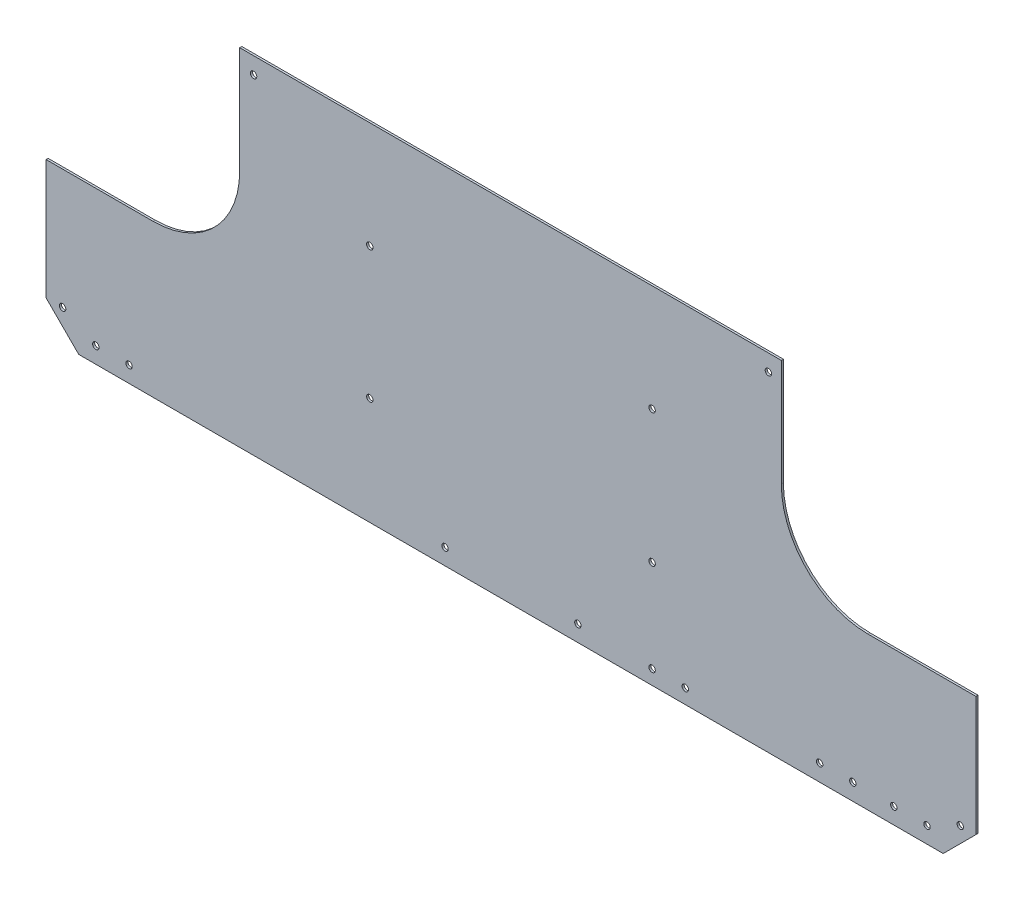
ISO-10303-21;
HEADER;
FILE_DESCRIPTION(('STEP AP214'),'2;1');
FILE_NAME('part.step','',(''),(''),'','','');
FILE_SCHEMA(('AUTOMOTIVE_DESIGN { 1 0 10303 214 1 1 1 1 }'));
ENDSEC;
DATA;
#1=APPLICATION_CONTEXT('core data for automotive mechanical design processes');
#2=APPLICATION_PROTOCOL_DEFINITION('international standard','automotive_design',2000,#1);
#3=PRODUCT_CONTEXT('',#1,'mechanical');
#4=PRODUCT('Part','Part','',(#3));
#5=PRODUCT_RELATED_PRODUCT_CATEGORY('part','',(#4));
#6=PRODUCT_DEFINITION_FORMATION('','',#4);
#7=PRODUCT_DEFINITION_CONTEXT('part definition',#1,'design');
#8=PRODUCT_DEFINITION('design','',#6,#7);
#9=PRODUCT_DEFINITION_SHAPE('','',#8);
#10=(LENGTH_UNIT() NAMED_UNIT(*) SI_UNIT(.MILLI.,.METRE.));
#11=(NAMED_UNIT(*) PLANE_ANGLE_UNIT() SI_UNIT($,.RADIAN.));
#12=(NAMED_UNIT(*) SI_UNIT($,.STERADIAN.) SOLID_ANGLE_UNIT());
#13=UNCERTAINTY_MEASURE_WITH_UNIT(LENGTH_MEASURE(1.E-05),#10,'distance_accuracy_value','');
#14=(GEOMETRIC_REPRESENTATION_CONTEXT(3) GLOBAL_UNCERTAINTY_ASSIGNED_CONTEXT((#13)) GLOBAL_UNIT_ASSIGNED_CONTEXT((#10,
#11,#12)) REPRESENTATION_CONTEXT('',''));
#15=CARTESIAN_POINT('',(0.,0.,0.));
#16=DIRECTION('',(0.,0.,1.));
#17=DIRECTION('',(1.,0.,0.));
#18=AXIS2_PLACEMENT_3D('',#15,#16,#17);
#19=CARTESIAN_POINT('',(-457.2,-304.8,0.79375));
#20=DIRECTION('',(0.,1.,0.));
#21=DIRECTION('',(0.,0.,1.));
#22=AXIS2_PLACEMENT_3D('',#19,#20,#21);
#23=PLANE('',#22);
#24=DIRECTION('',(0.,0.,1.));
#25=VECTOR('',#24,1.);
#26=CARTESIAN_POINT('',(-352.505582237217,-304.8,0.79375));
#27=LINE('',#26,#25);
#28=CARTESIAN_POINT('',(-352.505582237217,-304.8,-0.79375));
#29=VERTEX_POINT('',#28);
#30=CARTESIAN_POINT('',(-352.505582237217,-304.8,0.79375));
#31=VERTEX_POINT('',#30);
#32=EDGE_CURVE('E192',#29,#31,#27,.T.);
#33=ORIENTED_EDGE('',*,*,#32,.F.);
#34=DIRECTION('',(1.,0.,0.));
#35=VECTOR('',#34,1.);
#36=CARTESIAN_POINT('',(-457.2,-304.8,-0.79375));
#37=LINE('',#36,#35);
#38=CARTESIAN_POINT('',(308.635705779588,-304.8,-0.79375));
#39=VERTEX_POINT('',#38);
#40=EDGE_CURVE('E194',#29,#39,#37,.T.);
#41=ORIENTED_EDGE('',*,*,#40,.T.);
#42=DIRECTION('',(0.,0.,-1.));
#43=VECTOR('',#42,1.);
#44=CARTESIAN_POINT('',(308.635705779588,-304.8,0.79375));
#45=LINE('',#44,#43);
#46=CARTESIAN_POINT('',(308.635705779588,-304.8,0.79375));
#47=VERTEX_POINT('',#46);
#48=EDGE_CURVE('E189',#47,#39,#45,.T.);
#49=ORIENTED_EDGE('',*,*,#48,.F.);
#50=DIRECTION('',(1.,0.,0.));
#51=VECTOR('',#50,1.);
#52=CARTESIAN_POINT('',(-457.2,-304.8,0.79375));
#53=LINE('',#52,#51);
#54=EDGE_CURVE('E195',#31,#47,#53,.T.);
#55=ORIENTED_EDGE('',*,*,#54,.F.);
#56=EDGE_LOOP('',(#33,#41,#49,#55));
#57=FACE_BOUND('',#56,.T.);
#58=ADVANCED_FACE('F38',(#57),#23,.F.);
#59=CARTESIAN_POINT('',(0.,0.,0.79375));
#60=DIRECTION('',(0.,0.,1.));
#61=DIRECTION('',(1.,0.,0.));
#62=AXIS2_PLACEMENT_3D('',#59,#60,#61);
#63=PLANE('',#62);
#64=CARTESIAN_POINT('',(-129.884938330218,-121.629072032612,0.793750000000001));
#65=DIRECTION('',(0.,0.,1.));
#66=DIRECTION('',(1.,0.,0.));
#67=AXIS2_PLACEMENT_3D('',#64,#65,#66);
#68=CIRCLE('',#67,2.45745);
#69=CARTESIAN_POINT('',(-127.427488330218,-121.629072032612,0.793750000000001));
#70=VERTEX_POINT('',#69);
#71=EDGE_CURVE('E282',#70,#70,#68,.T.);
#72=ORIENTED_EDGE('',*,*,#71,.F.);
#73=EDGE_LOOP('',(#72));
#74=FACE_BOUND('',#73,.T.);
#75=CARTESIAN_POINT('',(-129.884938330218,-222.541034233955,0.793750000000001));
#76=DIRECTION('',(0.,0.,1.));
#77=DIRECTION('',(1.,0.,0.));
#78=AXIS2_PLACEMENT_3D('',#75,#76,#77);
#79=CIRCLE('',#78,2.45745);
#80=CARTESIAN_POINT('',(-127.427488330218,-222.541034233955,0.793750000000001));
#81=VERTEX_POINT('',#80);
#82=EDGE_CURVE('E286',#81,#81,#79,.T.);
#83=ORIENTED_EDGE('',*,*,#82,.F.);
#84=EDGE_LOOP('',(#83));
#85=FACE_BOUND('',#84,.T.);
#86=CARTESIAN_POINT('',(86.0150618725894,-223.22907197577,0.793750000000001));
#87=DIRECTION('',(0.,0.,1.));
#88=DIRECTION('',(1.,0.,0.));
#89=AXIS2_PLACEMENT_3D('',#86,#87,#88);
#90=CIRCLE('',#89,2.45744999999999);
#91=CARTESIAN_POINT('',(88.4725118725893,-223.22907197577,0.793750000000001));
#92=VERTEX_POINT('',#91);
#93=EDGE_CURVE('E290',#92,#92,#90,.T.);
#94=ORIENTED_EDGE('',*,*,#93,.F.);
#95=EDGE_LOOP('',(#94));
#96=FACE_BOUND('',#95,.T.);
#97=CARTESIAN_POINT('',(86.0150618725894,-121.629072032612,0.793750000000001));
#98=DIRECTION('',(0.,0.,1.));
#99=DIRECTION('',(1.,0.,0.));
#100=AXIS2_PLACEMENT_3D('',#97,#98,#99);
#101=CIRCLE('',#100,2.45744999999999);
#102=CARTESIAN_POINT('',(88.4725118725893,-121.629072032612,0.793750000000001));
#103=VERTEX_POINT('',#102);
#104=EDGE_CURVE('E294',#103,#103,#101,.T.);
#105=ORIENTED_EDGE('',*,*,#104,.F.);
#106=EDGE_LOOP('',(#105));
#107=FACE_BOUND('',#106,.T.);
#108=CARTESIAN_POINT('',(-314.03493822881,-292.470644008425,0.793750000000001));
#109=DIRECTION('',(0.,0.,1.));
#110=DIRECTION('',(1.,0.,0.));
#111=AXIS2_PLACEMENT_3D('',#108,#109,#110);
#112=CIRCLE('',#111,2.45744999999997);
#113=CARTESIAN_POINT('',(-311.57748822881,-292.470644008425,0.793750000000001));
#114=VERTEX_POINT('',#113);
#115=EDGE_CURVE('E298',#114,#114,#112,.T.);
#116=ORIENTED_EDGE('',*,*,#115,.F.);
#117=EDGE_LOOP('',(#116));
#118=FACE_BOUND('',#117,.T.);
#119=CARTESIAN_POINT('',(-339.43493822881,-292.470644008425,0.793750000000001));
#120=DIRECTION('',(0.,0.,1.));
#121=DIRECTION('',(1.,0.,0.));
#122=AXIS2_PLACEMENT_3D('',#119,#120,#121);
#123=CIRCLE('',#122,2.45744999999997);
#124=CARTESIAN_POINT('',(-336.97748822881,-292.470644008425,0.793750000000001));
#125=VERTEX_POINT('',#124);
#126=EDGE_CURVE('E302',#125,#125,#123,.T.);
#127=ORIENTED_EDGE('',*,*,#126,.F.);
#128=EDGE_LOOP('',(#127));
#129=FACE_BOUND('',#128,.T.);
#130=CARTESIAN_POINT('',(-364.83493822881,-279.770644008424,0.793750000000001));
#131=DIRECTION('',(0.,0.,1.));
#132=DIRECTION('',(1.,0.,0.));
#133=AXIS2_PLACEMENT_3D('',#130,#131,#132);
#134=CIRCLE('',#133,2.45744999999997);
#135=CARTESIAN_POINT('',(-362.37748822881,-279.770644008424,0.793750000000001));
#136=VERTEX_POINT('',#135);
#137=EDGE_CURVE('E306',#136,#136,#134,.T.);
#138=ORIENTED_EDGE('',*,*,#137,.F.);
#139=EDGE_LOOP('',(#138));
#140=FACE_BOUND('',#139,.T.);
#141=CARTESIAN_POINT('',(86.0055468827309,-293.702239208237,0.793750000000001));
#142=DIRECTION('',(0.,0.,1.));
#143=DIRECTION('',(1.,0.,0.));
#144=AXIS2_PLACEMENT_3D('',#141,#142,#143);
#145=CIRCLE('',#144,2.45744999999999);
#146=CARTESIAN_POINT('',(88.4629968827309,-293.702239208237,0.793750000000001));
#147=VERTEX_POINT('',#146);
#148=EDGE_CURVE('E310',#147,#147,#145,.T.);
#149=ORIENTED_EDGE('',*,*,#148,.F.);
#150=EDGE_LOOP('',(#149));
#151=FACE_BOUND('',#150,.T.);
#152=CARTESIAN_POINT('',(111.405546882731,-293.702239208237,0.793750000000001));
#153=DIRECTION('',(0.,0.,1.));
#154=DIRECTION('',(1.,0.,0.));
#155=AXIS2_PLACEMENT_3D('',#152,#153,#154);
#156=CIRCLE('',#155,2.45744999999999);
#157=CARTESIAN_POINT('',(113.862996882731,-293.702239208237,0.793750000000001));
#158=VERTEX_POINT('',#157);
#159=EDGE_CURVE('E314',#158,#158,#156,.T.);
#160=ORIENTED_EDGE('',*,*,#159,.F.);
#161=EDGE_LOOP('',(#160));
#162=FACE_BOUND('',#161,.T.);
#163=CARTESIAN_POINT('',(214.149530262216,-292.114748820738,0.793750000000001));
#164=DIRECTION('',(0.,0.,1.));
#165=DIRECTION('',(1.,0.,0.));
#166=AXIS2_PLACEMENT_3D('',#163,#164,#165);
#167=CIRCLE('',#166,2.45745);
#168=CARTESIAN_POINT('',(216.606980262216,-292.114748820738,0.793750000000001));
#169=VERTEX_POINT('',#168);
#170=EDGE_CURVE('E318',#169,#169,#167,.T.);
#171=ORIENTED_EDGE('',*,*,#170,.F.);
#172=EDGE_LOOP('',(#171));
#173=FACE_BOUND('',#172,.T.);
#174=CARTESIAN_POINT('',(239.549530262216,-292.114748820738,0.793750000000001));
#175=DIRECTION('',(0.,0.,1.));
#176=DIRECTION('',(1.,0.,0.));
#177=AXIS2_PLACEMENT_3D('',#174,#175,#176);
#178=CIRCLE('',#177,2.45745);
#179=CARTESIAN_POINT('',(242.006980262216,-292.114748820738,0.793750000000001));
#180=VERTEX_POINT('',#179);
#181=EDGE_CURVE('E322',#180,#180,#178,.T.);
#182=ORIENTED_EDGE('',*,*,#181,.F.);
#183=EDGE_LOOP('',(#182));
#184=FACE_BOUND('',#183,.T.);
#185=CARTESIAN_POINT('',(296.27626177119,-292.470644008388,0.793750000000001));
#186=DIRECTION('',(0.,0.,1.));
#187=DIRECTION('',(1.,0.,0.));
#188=AXIS2_PLACEMENT_3D('',#185,#186,#187);
#189=CIRCLE('',#188,2.45744999999997);
#190=CARTESIAN_POINT('',(298.73371177119,-292.470644008388,0.793750000000001));
#191=VERTEX_POINT('',#190);
#192=EDGE_CURVE('E326',#191,#191,#189,.T.);
#193=ORIENTED_EDGE('',*,*,#192,.F.);
#194=EDGE_LOOP('',(#193));
#195=FACE_BOUND('',#194,.T.);
#196=CARTESIAN_POINT('',(270.87626177119,-292.470644008388,0.793750000000001));
#197=DIRECTION('',(0.,0.,1.));
#198=DIRECTION('',(1.,0.,0.));
#199=AXIS2_PLACEMENT_3D('',#196,#197,#198);
#200=CIRCLE('',#199,2.45744999999997);
#201=CARTESIAN_POINT('',(273.33371177119,-292.470644008388,0.793750000000001));
#202=VERTEX_POINT('',#201);
#203=EDGE_CURVE('E330',#202,#202,#200,.T.);
#204=ORIENTED_EDGE('',*,*,#203,.F.);
#205=EDGE_LOOP('',(#204));
#206=FACE_BOUND('',#205,.T.);
#207=CARTESIAN_POINT('',(321.67626177119,-279.770644008388,0.793750000000001));
#208=DIRECTION('',(0.,0.,1.));
#209=DIRECTION('',(1.,0.,0.));
#210=AXIS2_PLACEMENT_3D('',#207,#208,#209);
#211=CIRCLE('',#210,2.45744999999997);
#212=CARTESIAN_POINT('',(324.13371177119,-279.770644008388,0.793750000000001));
#213=VERTEX_POINT('',#212);
#214=EDGE_CURVE('E334',#213,#213,#211,.T.);
#215=ORIENTED_EDGE('',*,*,#214,.F.);
#216=EDGE_LOOP('',(#215));
#217=FACE_BOUND('',#216,.T.);
#218=CARTESIAN_POINT('',(174.915061771195,-52.7581440084142,0.793750000000001));
#219=DIRECTION('',(0.,0.,1.));
#220=DIRECTION('',(1.,0.,0.));
#221=AXIS2_PLACEMENT_3D('',#218,#219,#220);
#222=CIRCLE('',#221,2.45745);
#223=CARTESIAN_POINT('',(177.372511771195,-52.7581440084142,0.793750000000001));
#224=VERTEX_POINT('',#223);
#225=EDGE_CURVE('E338',#224,#224,#222,.T.);
#226=ORIENTED_EDGE('',*,*,#225,.F.);
#227=EDGE_LOOP('',(#226));
#228=FACE_BOUND('',#227,.T.);
#229=CARTESIAN_POINT('',(-218.784938228805,-52.7581440084113,0.793750000000001));
#230=DIRECTION('',(0.,0.,1.));
#231=DIRECTION('',(1.,0.,0.));
#232=AXIS2_PLACEMENT_3D('',#229,#230,#231);
#233=CIRCLE('',#232,2.45745);
#234=CARTESIAN_POINT('',(-216.327488228805,-52.7581440084113,0.793750000000001));
#235=VERTEX_POINT('',#234);
#236=EDGE_CURVE('E342',#235,#235,#233,.T.);
#237=ORIENTED_EDGE('',*,*,#236,.F.);
#238=EDGE_LOOP('',(#237));
#239=FACE_BOUND('',#238,.T.);
#240=CARTESIAN_POINT('',(-72.3793382288082,-292.470644008412,0.793750000000001));
#241=DIRECTION('',(0.,0.,1.));
#242=DIRECTION('',(1.,0.,0.));
#243=AXIS2_PLACEMENT_3D('',#240,#241,#242);
#244=CIRCLE('',#243,2.45744999999999);
#245=CARTESIAN_POINT('',(-69.9218882288082,-292.470644008412,0.793750000000001));
#246=VERTEX_POINT('',#245);
#247=EDGE_CURVE('E346',#246,#246,#244,.T.);
#248=ORIENTED_EDGE('',*,*,#247,.F.);
#249=EDGE_LOOP('',(#248));
#250=FACE_BOUND('',#249,.T.);
#251=CARTESIAN_POINT('',(29.2206617711918,-292.470644008414,0.793750000000001));
#252=DIRECTION('',(0.,0.,1.));
#253=DIRECTION('',(1.,0.,0.));
#254=AXIS2_PLACEMENT_3D('',#251,#252,#253);
#255=CIRCLE('',#254,2.45744999999999);
#256=CARTESIAN_POINT('',(31.6781117711918,-292.470644008414,0.793750000000001));
#257=VERTEX_POINT('',#256);
#258=EDGE_CURVE('E349',#257,#257,#255,.T.);
#259=ORIENTED_EDGE('',*,*,#258,.F.);
#260=EDGE_LOOP('',(#259));
#261=FACE_BOUND('',#260,.T.);
#262=DIRECTION('',(0.,-1.,0.));
#263=VECTOR('',#262,1.);
#264=CARTESIAN_POINT('',(184.821061771176,-121.896344020848,0.79375));
#265=LINE('',#264,#263);
#266=CARTESIAN_POINT('',(184.821061771176,-40.0581440083884,0.79375));
#267=VERTEX_POINT('',#266);
#268=CARTESIAN_POINT('',(184.821061771176,-121.896344020848,0.79375));
#269=VERTEX_POINT('',#268);
#270=EDGE_CURVE('E133',#267,#269,#265,.T.);
#271=ORIENTED_EDGE('',*,*,#270,.F.);
#272=DIRECTION('',(-1.,0.,0.));
#273=VECTOR('',#272,1.);
#274=CARTESIAN_POINT('',(-374.994938228831,-40.0581440083885,0.79375));
#275=LINE('',#274,#273);
#276=CARTESIAN_POINT('',(-229.402738216363,-40.0581440083885,0.79375));
#277=VERTEX_POINT('',#276);
#278=EDGE_CURVE('E60',#267,#277,#275,.T.);
#279=ORIENTED_EDGE('',*,*,#278,.T.);
#280=DIRECTION('',(0.,1.,0.));
#281=VECTOR('',#280,1.);
#282=CARTESIAN_POINT('',(-229.402738216363,-64.7463440208438,0.79375));
#283=LINE('',#282,#281);
#284=CARTESIAN_POINT('',(-229.402738216364,-121.896344020841,0.79375));
#285=VERTEX_POINT('',#284);
#286=EDGE_CURVE('E162',#285,#277,#283,.T.);
#287=ORIENTED_EDGE('',*,*,#286,.F.);
#288=CARTESIAN_POINT('',(-295.696738216364,-121.896344020841,0.79375));
#289=DIRECTION('',(0.,0.,1.));
#290=DIRECTION('',(-1.,0.,0.));
#291=AXIS2_PLACEMENT_3D('',#288,#289,#290);
#292=CIRCLE('',#291,66.2940000000005);
#293=CARTESIAN_POINT('',(-295.696738216365,-188.190344020841,0.79375));
#294=VERTEX_POINT('',#293);
#295=EDGE_CURVE('E159',#294,#285,#292,.T.);
#296=ORIENTED_EDGE('',*,*,#295,.F.);
#297=DIRECTION('',(1.,0.,0.));
#298=VECTOR('',#297,1.);
#299=CARTESIAN_POINT('',(-352.846738216365,-188.19034402084,0.79375));
#300=LINE('',#299,#298);
#301=CARTESIAN_POINT('',(-377.534938228824,-188.19034402084,0.79375));
#302=VERTEX_POINT('',#301);
#303=EDGE_CURVE('E156',#302,#294,#300,.T.);
#304=ORIENTED_EDGE('',*,*,#303,.F.);
#305=DIRECTION('',(0.,-1.,0.));
#306=VECTOR('',#305,1.);
#307=CARTESIAN_POINT('',(-377.534938228825,-279.770644008392,0.79375));
#308=LINE('',#307,#306);
#309=CARTESIAN_POINT('',(-377.534938228825,-279.770644008392,0.79375));
#310=VERTEX_POINT('',#309);
#311=EDGE_CURVE('E180',#302,#310,#308,.T.);
#312=ORIENTED_EDGE('',*,*,#311,.T.);
#313=DIRECTION('',(0.707106781186551,-0.707106781186544,0.));
#314=VECTOR('',#313,1.);
#315=CARTESIAN_POINT('',(-352.134938228809,-305.170644008408,0.79375));
#316=LINE('',#315,#314);
#317=EDGE_CURVE('E182',#310,#31,#316,.T.);
#318=ORIENTED_EDGE('',*,*,#317,.T.);
#319=ORIENTED_EDGE('',*,*,#54,.T.);
#320=DIRECTION('',(0.707106781186544,0.707106781186551,0.));
#321=VECTOR('',#320,1.);
#322=CARTESIAN_POINT('',(308.265061771173,-305.170644008415,0.79375));
#323=LINE('',#322,#321);
#324=CARTESIAN_POINT('',(333.665061771173,-279.770644008415,0.79375));
#325=VERTEX_POINT('',#324);
#326=EDGE_CURVE('E176',#47,#325,#323,.T.);
#327=ORIENTED_EDGE('',*,*,#326,.T.);
#328=DIRECTION('',(0.,1.,0.));
#329=VECTOR('',#328,1.);
#330=CARTESIAN_POINT('',(333.665061771173,-279.770644008415,0.79375));
#331=LINE('',#330,#329);
#332=CARTESIAN_POINT('',(333.665061771174,-188.190344020849,0.79375));
#333=VERTEX_POINT('',#332);
#334=EDGE_CURVE('E146',#325,#333,#331,.T.);
#335=ORIENTED_EDGE('',*,*,#334,.T.);
#336=DIRECTION('',(1.,0.,0.));
#337=VECTOR('',#336,1.);
#338=CARTESIAN_POINT('',(251.115061771175,-188.190344020849,0.79375));
#339=LINE('',#338,#337);
#340=CARTESIAN_POINT('',(251.115061771175,-188.190344020849,0.79375));
#341=VERTEX_POINT('',#340);
#342=EDGE_CURVE('E52',#341,#333,#339,.T.);
#343=ORIENTED_EDGE('',*,*,#342,.F.);
#344=CARTESIAN_POINT('',(251.115061771176,-121.896344020849,0.79375));
#345=DIRECTION('',(0.,0.,1.));
#346=DIRECTION('',(1.,0.,0.));
#347=AXIS2_PLACEMENT_3D('',#344,#345,#346);
#348=CIRCLE('',#347,66.294);
#349=EDGE_CURVE('E136',#269,#341,#348,.T.);
#350=ORIENTED_EDGE('',*,*,#349,.F.);
#351=EDGE_LOOP('',(#271,#279,#287,#296,#304,#312,#318,#319,#327,#335,#343,#350));
#352=FACE_BOUND('',#351,.T.);
#353=ADVANCED_FACE('F143',(#74,#85,#96,#107,#118,#129,#140,#151,#162,#173,#184,#195,#206,#217,
#228,#239,#250,#261,#352),#63,.T.);
#354=CARTESIAN_POINT('',(0.,0.,-0.79375));
#355=DIRECTION('',(0.,0.,1.));
#356=DIRECTION('',(1.,0.,0.));
#357=AXIS2_PLACEMENT_3D('',#354,#355,#356);
#358=PLANE('',#357);
#359=CARTESIAN_POINT('',(-129.884938330218,-121.629072032612,-0.79375));
#360=DIRECTION('',(0.,0.,1.));
#361=DIRECTION('',(1.,0.,0.));
#362=AXIS2_PLACEMENT_3D('',#359,#360,#361);
#363=CIRCLE('',#362,2.45745);
#364=CARTESIAN_POINT('',(-127.427488330218,-121.629072032612,-0.79375));
#365=VERTEX_POINT('',#364);
#366=EDGE_CURVE('E418',#365,#365,#363,.T.);
#367=ORIENTED_EDGE('',*,*,#366,.T.);
#368=EDGE_LOOP('',(#367));
#369=FACE_BOUND('',#368,.T.);
#370=CARTESIAN_POINT('',(-129.884938330218,-222.541034233955,-0.79375));
#371=DIRECTION('',(0.,0.,1.));
#372=DIRECTION('',(1.,0.,0.));
#373=AXIS2_PLACEMENT_3D('',#370,#371,#372);
#374=CIRCLE('',#373,2.45745);
#375=CARTESIAN_POINT('',(-127.427488330218,-222.541034233955,-0.79375));
#376=VERTEX_POINT('',#375);
#377=EDGE_CURVE('E414',#376,#376,#374,.T.);
#378=ORIENTED_EDGE('',*,*,#377,.T.);
#379=EDGE_LOOP('',(#378));
#380=FACE_BOUND('',#379,.T.);
#381=CARTESIAN_POINT('',(86.0150618725894,-223.22907197577,-0.79375));
#382=DIRECTION('',(0.,0.,1.));
#383=DIRECTION('',(1.,0.,0.));
#384=AXIS2_PLACEMENT_3D('',#381,#382,#383);
#385=CIRCLE('',#384,2.45745);
#386=CARTESIAN_POINT('',(88.4725118725894,-223.22907197577,-0.79375));
#387=VERTEX_POINT('',#386);
#388=EDGE_CURVE('E410',#387,#387,#385,.T.);
#389=ORIENTED_EDGE('',*,*,#388,.T.);
#390=EDGE_LOOP('',(#389));
#391=FACE_BOUND('',#390,.T.);
#392=CARTESIAN_POINT('',(86.0150618725894,-121.629072032612,-0.79375));
#393=DIRECTION('',(0.,0.,1.));
#394=DIRECTION('',(1.,0.,0.));
#395=AXIS2_PLACEMENT_3D('',#392,#393,#394);
#396=CIRCLE('',#395,2.45745);
#397=CARTESIAN_POINT('',(88.4725118725894,-121.629072032612,-0.79375));
#398=VERTEX_POINT('',#397);
#399=EDGE_CURVE('E406',#398,#398,#396,.T.);
#400=ORIENTED_EDGE('',*,*,#399,.T.);
#401=EDGE_LOOP('',(#400));
#402=FACE_BOUND('',#401,.T.);
#403=CARTESIAN_POINT('',(-314.03493822881,-292.470644008425,-0.79375));
#404=DIRECTION('',(0.,0.,1.));
#405=DIRECTION('',(1.,0.,0.));
#406=AXIS2_PLACEMENT_3D('',#403,#404,#405);
#407=CIRCLE('',#406,2.45744999999997);
#408=CARTESIAN_POINT('',(-311.57748822881,-292.470644008425,-0.79375));
#409=VERTEX_POINT('',#408);
#410=EDGE_CURVE('E402',#409,#409,#407,.T.);
#411=ORIENTED_EDGE('',*,*,#410,.T.);
#412=EDGE_LOOP('',(#411));
#413=FACE_BOUND('',#412,.T.);
#414=CARTESIAN_POINT('',(-339.43493822881,-292.470644008425,-0.79375));
#415=DIRECTION('',(0.,0.,1.));
#416=DIRECTION('',(1.,0.,0.));
#417=AXIS2_PLACEMENT_3D('',#414,#415,#416);
#418=CIRCLE('',#417,2.45744999999997);
#419=CARTESIAN_POINT('',(-336.97748822881,-292.470644008425,-0.79375));
#420=VERTEX_POINT('',#419);
#421=EDGE_CURVE('E398',#420,#420,#418,.T.);
#422=ORIENTED_EDGE('',*,*,#421,.T.);
#423=EDGE_LOOP('',(#422));
#424=FACE_BOUND('',#423,.T.);
#425=CARTESIAN_POINT('',(-364.83493822881,-279.770644008424,-0.79375));
#426=DIRECTION('',(0.,0.,1.));
#427=DIRECTION('',(1.,0.,0.));
#428=AXIS2_PLACEMENT_3D('',#425,#426,#427);
#429=CIRCLE('',#428,2.45744999999997);
#430=CARTESIAN_POINT('',(-362.37748822881,-279.770644008424,-0.79375));
#431=VERTEX_POINT('',#430);
#432=EDGE_CURVE('E394',#431,#431,#429,.T.);
#433=ORIENTED_EDGE('',*,*,#432,.T.);
#434=EDGE_LOOP('',(#433));
#435=FACE_BOUND('',#434,.T.);
#436=CARTESIAN_POINT('',(86.0055468827309,-293.702239208237,-0.79375));
#437=DIRECTION('',(0.,0.,1.));
#438=DIRECTION('',(1.,0.,0.));
#439=AXIS2_PLACEMENT_3D('',#436,#437,#438);
#440=CIRCLE('',#439,2.45745);
#441=CARTESIAN_POINT('',(88.4629968827309,-293.702239208237,-0.79375));
#442=VERTEX_POINT('',#441);
#443=EDGE_CURVE('E390',#442,#442,#440,.T.);
#444=ORIENTED_EDGE('',*,*,#443,.T.);
#445=EDGE_LOOP('',(#444));
#446=FACE_BOUND('',#445,.T.);
#447=CARTESIAN_POINT('',(111.405546882731,-293.702239208237,-0.79375));
#448=DIRECTION('',(0.,0.,1.));
#449=DIRECTION('',(1.,0.,0.));
#450=AXIS2_PLACEMENT_3D('',#447,#448,#449);
#451=CIRCLE('',#450,2.45745);
#452=CARTESIAN_POINT('',(113.862996882731,-293.702239208237,-0.79375));
#453=VERTEX_POINT('',#452);
#454=EDGE_CURVE('E386',#453,#453,#451,.T.);
#455=ORIENTED_EDGE('',*,*,#454,.T.);
#456=EDGE_LOOP('',(#455));
#457=FACE_BOUND('',#456,.T.);
#458=CARTESIAN_POINT('',(214.149530262216,-292.114748820738,-0.79375));
#459=DIRECTION('',(0.,0.,1.));
#460=DIRECTION('',(1.,0.,0.));
#461=AXIS2_PLACEMENT_3D('',#458,#459,#460);
#462=CIRCLE('',#461,2.45745);
#463=CARTESIAN_POINT('',(216.606980262216,-292.114748820738,-0.79375));
#464=VERTEX_POINT('',#463);
#465=EDGE_CURVE('E382',#464,#464,#462,.T.);
#466=ORIENTED_EDGE('',*,*,#465,.T.);
#467=EDGE_LOOP('',(#466));
#468=FACE_BOUND('',#467,.T.);
#469=CARTESIAN_POINT('',(239.549530262216,-292.114748820738,-0.79375));
#470=DIRECTION('',(0.,0.,1.));
#471=DIRECTION('',(1.,0.,0.));
#472=AXIS2_PLACEMENT_3D('',#469,#470,#471);
#473=CIRCLE('',#472,2.45745);
#474=CARTESIAN_POINT('',(242.006980262216,-292.114748820738,-0.79375));
#475=VERTEX_POINT('',#474);
#476=EDGE_CURVE('E378',#475,#475,#473,.T.);
#477=ORIENTED_EDGE('',*,*,#476,.T.);
#478=EDGE_LOOP('',(#477));
#479=FACE_BOUND('',#478,.T.);
#480=CARTESIAN_POINT('',(296.27626177119,-292.470644008388,-0.79375));
#481=DIRECTION('',(0.,0.,1.));
#482=DIRECTION('',(1.,0.,0.));
#483=AXIS2_PLACEMENT_3D('',#480,#481,#482);
#484=CIRCLE('',#483,2.45744999999997);
#485=CARTESIAN_POINT('',(298.73371177119,-292.470644008388,-0.79375));
#486=VERTEX_POINT('',#485);
#487=EDGE_CURVE('E374',#486,#486,#484,.T.);
#488=ORIENTED_EDGE('',*,*,#487,.T.);
#489=EDGE_LOOP('',(#488));
#490=FACE_BOUND('',#489,.T.);
#491=CARTESIAN_POINT('',(270.87626177119,-292.470644008388,-0.79375));
#492=DIRECTION('',(0.,0.,1.));
#493=DIRECTION('',(1.,0.,0.));
#494=AXIS2_PLACEMENT_3D('',#491,#492,#493);
#495=CIRCLE('',#494,2.45744999999997);
#496=CARTESIAN_POINT('',(273.33371177119,-292.470644008388,-0.79375));
#497=VERTEX_POINT('',#496);
#498=EDGE_CURVE('E370',#497,#497,#495,.T.);
#499=ORIENTED_EDGE('',*,*,#498,.T.);
#500=EDGE_LOOP('',(#499));
#501=FACE_BOUND('',#500,.T.);
#502=CARTESIAN_POINT('',(321.67626177119,-279.770644008388,-0.79375));
#503=DIRECTION('',(0.,0.,1.));
#504=DIRECTION('',(1.,0.,0.));
#505=AXIS2_PLACEMENT_3D('',#502,#503,#504);
#506=CIRCLE('',#505,2.45744999999997);
#507=CARTESIAN_POINT('',(324.13371177119,-279.770644008388,-0.79375));
#508=VERTEX_POINT('',#507);
#509=EDGE_CURVE('E366',#508,#508,#506,.T.);
#510=ORIENTED_EDGE('',*,*,#509,.T.);
#511=EDGE_LOOP('',(#510));
#512=FACE_BOUND('',#511,.T.);
#513=CARTESIAN_POINT('',(174.915061771195,-52.7581440084142,-0.79375));
#514=DIRECTION('',(0.,0.,1.));
#515=DIRECTION('',(1.,0.,0.));
#516=AXIS2_PLACEMENT_3D('',#513,#514,#515);
#517=CIRCLE('',#516,2.45745);
#518=CARTESIAN_POINT('',(177.372511771195,-52.7581440084142,-0.79375));
#519=VERTEX_POINT('',#518);
#520=EDGE_CURVE('E362',#519,#519,#517,.T.);
#521=ORIENTED_EDGE('',*,*,#520,.T.);
#522=EDGE_LOOP('',(#521));
#523=FACE_BOUND('',#522,.T.);
#524=CARTESIAN_POINT('',(-218.784938228805,-52.7581440084113,-0.79375));
#525=DIRECTION('',(0.,0.,1.));
#526=DIRECTION('',(1.,0.,0.));
#527=AXIS2_PLACEMENT_3D('',#524,#525,#526);
#528=CIRCLE('',#527,2.45745);
#529=CARTESIAN_POINT('',(-216.327488228805,-52.7581440084113,-0.79375));
#530=VERTEX_POINT('',#529);
#531=EDGE_CURVE('E358',#530,#530,#528,.T.);
#532=ORIENTED_EDGE('',*,*,#531,.T.);
#533=EDGE_LOOP('',(#532));
#534=FACE_BOUND('',#533,.T.);
#535=CARTESIAN_POINT('',(-72.3793382288082,-292.470644008412,-0.79375));
#536=DIRECTION('',(0.,0.,1.));
#537=DIRECTION('',(1.,0.,0.));
#538=AXIS2_PLACEMENT_3D('',#535,#536,#537);
#539=CIRCLE('',#538,2.45745);
#540=CARTESIAN_POINT('',(-69.9218882288082,-292.470644008412,-0.79375));
#541=VERTEX_POINT('',#540);
#542=EDGE_CURVE('E351',#541,#541,#539,.T.);
#543=ORIENTED_EDGE('',*,*,#542,.T.);
#544=EDGE_LOOP('',(#543));
#545=FACE_BOUND('',#544,.T.);
#546=CARTESIAN_POINT('',(29.2206617711918,-292.470644008414,-0.79375));
#547=DIRECTION('',(0.,0.,1.));
#548=DIRECTION('',(1.,0.,0.));
#549=AXIS2_PLACEMENT_3D('',#546,#547,#548);
#550=CIRCLE('',#549,2.45745);
#551=CARTESIAN_POINT('',(31.6781117711918,-292.470644008414,-0.79375));
#552=VERTEX_POINT('',#551);
#553=EDGE_CURVE('E140',#552,#552,#550,.T.);
#554=ORIENTED_EDGE('',*,*,#553,.T.);
#555=EDGE_LOOP('',(#554));
#556=FACE_BOUND('',#555,.T.);
#557=DIRECTION('',(-1.,0.,0.));
#558=VECTOR('',#557,1.);
#559=CARTESIAN_POINT('',(0.,-40.0581440083885,-0.79375));
#560=LINE('',#559,#558);
#561=CARTESIAN_POINT('',(184.821061771176,-40.0581440083885,-0.79375));
#562=VERTEX_POINT('',#561);
#563=CARTESIAN_POINT('',(-229.402738216363,-40.0581440083816,-0.79375));
#564=VERTEX_POINT('',#563);
#565=EDGE_CURVE('E205',#562,#564,#560,.T.);
#566=ORIENTED_EDGE('',*,*,#565,.F.);
#567=DIRECTION('',(0.,-1.,0.));
#568=VECTOR('',#567,1.);
#569=CARTESIAN_POINT('',(184.821061771176,0.,-0.79375));
#570=LINE('',#569,#568);
#571=CARTESIAN_POINT('',(184.821061771176,-121.896344020848,-0.79375));
#572=VERTEX_POINT('',#571);
#573=EDGE_CURVE('E153',#562,#572,#570,.T.);
#574=ORIENTED_EDGE('',*,*,#573,.T.);
#575=CARTESIAN_POINT('',(251.115061771176,-121.896344020849,-0.79375));
#576=DIRECTION('',(0.,0.,1.));
#577=DIRECTION('',(1.,0.,0.));
#578=AXIS2_PLACEMENT_3D('',#575,#576,#577);
#579=CIRCLE('',#578,66.294);
#580=CARTESIAN_POINT('',(251.115061771175,-188.190344020849,-0.79375));
#581=VERTEX_POINT('',#580);
#582=EDGE_CURVE('E12',#572,#581,#579,.T.);
#583=ORIENTED_EDGE('',*,*,#582,.T.);
#584=DIRECTION('',(1.,0.,0.));
#585=VECTOR('',#584,1.);
#586=CARTESIAN_POINT('',(0.,-188.190344020849,-0.79375));
#587=LINE('',#586,#585);
#588=CARTESIAN_POINT('',(333.665061771174,-188.190344020849,-0.79375));
#589=VERTEX_POINT('',#588);
#590=EDGE_CURVE('E130',#581,#589,#587,.T.);
#591=ORIENTED_EDGE('',*,*,#590,.T.);
#592=DIRECTION('',(0.,1.,0.));
#593=VECTOR('',#592,1.);
#594=CARTESIAN_POINT('',(333.665061771176,-2.96763328283615E-12,-0.79375));
#595=LINE('',#594,#593);
#596=CARTESIAN_POINT('',(333.665061771173,-279.770644008415,-0.79375));
#597=VERTEX_POINT('',#596);
#598=EDGE_CURVE('E202',#597,#589,#595,.T.);
#599=ORIENTED_EDGE('',*,*,#598,.F.);
#600=DIRECTION('',(0.707106781186544,0.707106781186551,0.));
#601=VECTOR('',#600,1.);
#602=CARTESIAN_POINT('',(306.717852889796,-306.717852889793,-0.79375));
#603=LINE('',#602,#601);
#604=EDGE_CURVE('E198',#39,#597,#603,.T.);
#605=ORIENTED_EDGE('',*,*,#604,.F.);
#606=ORIENTED_EDGE('',*,*,#40,.F.);
#607=DIRECTION('',(0.707106781186551,-0.707106781186544,0.));
#608=VECTOR('',#607,1.);
#609=CARTESIAN_POINT('',(-328.652791118607,-328.65279111861,-0.79375));
#610=LINE('',#609,#608);
#611=CARTESIAN_POINT('',(-377.534938228825,-279.770644008392,-0.79375));
#612=VERTEX_POINT('',#611);
#613=EDGE_CURVE('E209',#612,#29,#610,.T.);
#614=ORIENTED_EDGE('',*,*,#613,.F.);
#615=DIRECTION('',(0.,-1.,0.));
#616=VECTOR('',#615,1.);
#617=CARTESIAN_POINT('',(-377.534938228832,-8.39453524272366E-12,-0.79375));
#618=LINE('',#617,#616);
#619=CARTESIAN_POINT('',(-377.534938228824,-188.19034402084,-0.79375));
#620=VERTEX_POINT('',#619);
#621=EDGE_CURVE('E207',#620,#612,#618,.T.);
#622=ORIENTED_EDGE('',*,*,#621,.F.);
#623=DIRECTION('',(1.,0.,0.));
#624=VECTOR('',#623,1.);
#625=CARTESIAN_POINT('',(-2.37631871239976E-12,-188.190344020845,-0.79375));
#626=LINE('',#625,#624);
#627=CARTESIAN_POINT('',(-295.696738216365,-188.190344020841,-0.79375));
#628=VERTEX_POINT('',#627);
#629=EDGE_CURVE('E173',#620,#628,#626,.T.);
#630=ORIENTED_EDGE('',*,*,#629,.T.);
#631=CARTESIAN_POINT('',(-295.696738216364,-121.896344020841,-0.79375));
#632=DIRECTION('',(0.,0.,1.));
#633=DIRECTION('',(1.,0.,0.));
#634=AXIS2_PLACEMENT_3D('',#631,#632,#633);
#635=CIRCLE('',#634,66.2940000000005);
#636=CARTESIAN_POINT('',(-229.402738216364,-121.896344020841,-0.79375));
#637=VERTEX_POINT('',#636);
#638=EDGE_CURVE('E214',#628,#637,#635,.T.);
#639=ORIENTED_EDGE('',*,*,#638,.T.);
#640=DIRECTION('',(0.,1.,0.));
#641=VECTOR('',#640,1.);
#642=CARTESIAN_POINT('',(-229.402738216363,0.,-0.79375));
#643=LINE('',#642,#641);
#644=EDGE_CURVE('E167',#637,#564,#643,.T.);
#645=ORIENTED_EDGE('',*,*,#644,.T.);
#646=EDGE_LOOP('',(#566,#574,#583,#591,#599,#605,#606,#614,#622,#630,#639,#645));
#647=FACE_BOUND('',#646,.T.);
#648=ADVANCED_FACE('F229',(#369,#380,#391,#402,#413,#424,#435,#446,#457,#468,#479,#490,#501,
#512,#523,#534,#545,#556,#647),#358,.F.);
#649=CARTESIAN_POINT('',(-352.134938228809,-305.170644008408,-1.74625));
#650=DIRECTION('',(-0.707106781186544,-0.707106781186551,0.));
#651=DIRECTION('',(0.707106781186551,-0.707106781186544,0.));
#652=AXIS2_PLACEMENT_3D('',#649,#650,#651);
#653=PLANE('',#652);
#654=ORIENTED_EDGE('',*,*,#32,.T.);
#655=ORIENTED_EDGE('',*,*,#317,.F.);
#656=DIRECTION('',(0.,0.,1.));
#657=VECTOR('',#656,1.);
#658=CARTESIAN_POINT('',(-377.534938228825,-279.770644008392,-1.74625));
#659=LINE('',#658,#657);
#660=EDGE_CURVE('E186',#612,#310,#659,.T.);
#661=ORIENTED_EDGE('',*,*,#660,.F.);
#662=ORIENTED_EDGE('',*,*,#613,.T.);
#663=EDGE_LOOP('',(#654,#655,#661,#662));
#664=FACE_BOUND('',#663,.T.);
#665=ADVANCED_FACE('F246',(#664),#653,.T.);
#666=CARTESIAN_POINT('',(-377.534938228825,-279.770644008392,-1.74625));
#667=DIRECTION('',(-1.,0.,0.));
#668=DIRECTION('',(0.,-1.,0.));
#669=AXIS2_PLACEMENT_3D('',#666,#667,#668);
#670=PLANE('',#669);
#671=DIRECTION('',(0.,0.,1.));
#672=VECTOR('',#671,1.);
#673=CARTESIAN_POINT('',(-377.534938228824,-188.19034402084,-1.74625));
#674=LINE('',#673,#672);
#675=EDGE_CURVE('E164',#620,#302,#674,.T.);
#676=ORIENTED_EDGE('',*,*,#675,.F.);
#677=ORIENTED_EDGE('',*,*,#621,.T.);
#678=ORIENTED_EDGE('',*,*,#660,.T.);
#679=ORIENTED_EDGE('',*,*,#311,.F.);
#680=EDGE_LOOP('',(#676,#677,#678,#679));
#681=FACE_BOUND('',#680,.T.);
#682=ADVANCED_FACE('F241',(#681),#670,.T.);
#683=CARTESIAN_POINT('',(-374.994938228831,-40.0581440083885,-1.74625));
#684=DIRECTION('',(0.,1.,0.));
#685=DIRECTION('',(-1.,0.,0.));
#686=AXIS2_PLACEMENT_3D('',#683,#684,#685);
#687=PLANE('',#686);
#688=DIRECTION('',(0.,0.,1.));
#689=VECTOR('',#688,1.);
#690=CARTESIAN_POINT('',(184.821061771176,-40.0581440083885,-1.74625));
#691=LINE('',#690,#689);
#692=EDGE_CURVE('E45',#562,#267,#691,.T.);
#693=ORIENTED_EDGE('',*,*,#692,.F.);
#694=ORIENTED_EDGE('',*,*,#565,.T.);
#695=DIRECTION('',(0.,0.,-1.));
#696=VECTOR('',#695,1.);
#697=CARTESIAN_POINT('',(-229.402738216363,-40.0581440083885,-1.74625));
#698=LINE('',#697,#696);
#699=EDGE_CURVE('E211',#277,#564,#698,.T.);
#700=ORIENTED_EDGE('',*,*,#699,.F.);
#701=ORIENTED_EDGE('',*,*,#278,.F.);
#702=EDGE_LOOP('',(#693,#694,#700,#701));
#703=FACE_BOUND('',#702,.T.);
#704=ADVANCED_FACE('F224',(#703),#687,.T.);
#705=CARTESIAN_POINT('',(333.665061771173,-279.770644008415,-1.74625));
#706=DIRECTION('',(1.,0.,0.));
#707=DIRECTION('',(0.,1.,0.));
#708=AXIS2_PLACEMENT_3D('',#705,#706,#707);
#709=PLANE('',#708);
#710=DIRECTION('',(0.,0.,-1.));
#711=VECTOR('',#710,1.);
#712=CARTESIAN_POINT('',(333.665061771174,-188.190344020849,-1.74625));
#713=LINE('',#712,#711);
#714=EDGE_CURVE('E217',#333,#589,#713,.T.);
#715=ORIENTED_EDGE('',*,*,#714,.F.);
#716=ORIENTED_EDGE('',*,*,#334,.F.);
#717=DIRECTION('',(0.,0.,1.));
#718=VECTOR('',#717,1.);
#719=CARTESIAN_POINT('',(333.665061771173,-279.770644008415,-1.74625));
#720=LINE('',#719,#718);
#721=EDGE_CURVE('E185',#597,#325,#720,.T.);
#722=ORIENTED_EDGE('',*,*,#721,.F.);
#723=ORIENTED_EDGE('',*,*,#598,.T.);
#724=EDGE_LOOP('',(#715,#716,#722,#723));
#725=FACE_BOUND('',#724,.T.);
#726=ADVANCED_FACE('F258',(#725),#709,.T.);
#727=CARTESIAN_POINT('',(308.265061771173,-305.170644008415,-1.74625));
#728=DIRECTION('',(0.707106781186551,-0.707106781186544,0.));
#729=DIRECTION('',(0.707106781186544,0.707106781186551,0.));
#730=AXIS2_PLACEMENT_3D('',#727,#728,#729);
#731=PLANE('',#730);
#732=ORIENTED_EDGE('',*,*,#48,.T.);
#733=ORIENTED_EDGE('',*,*,#604,.T.);
#734=ORIENTED_EDGE('',*,*,#721,.T.);
#735=ORIENTED_EDGE('',*,*,#326,.F.);
#736=EDGE_LOOP('',(#732,#733,#734,#735));
#737=FACE_BOUND('',#736,.T.);
#738=ADVANCED_FACE('F254',(#737),#731,.T.);
#739=CARTESIAN_POINT('',(-295.696738216364,-121.896344020841,-1.74625));
#740=DIRECTION('',(0.,0.,1.));
#741=DIRECTION('',(1.,0.,0.));
#742=AXIS2_PLACEMENT_3D('',#739,#740,#741);
#743=CYLINDRICAL_SURFACE('',#742,66.2940000000005);
#744=DIRECTION('',(0.,0.,1.));
#745=VECTOR('',#744,1.);
#746=CARTESIAN_POINT('',(-295.696738216365,-188.190344020841,-1.74625));
#747=LINE('',#746,#745);
#748=EDGE_CURVE('E168',#628,#294,#747,.T.);
#749=ORIENTED_EDGE('',*,*,#748,.T.);
#750=ORIENTED_EDGE('',*,*,#295,.T.);
#751=DIRECTION('',(0.,0.,1.));
#752=VECTOR('',#751,1.);
#753=CARTESIAN_POINT('',(-229.402738216364,-121.896344020841,-1.74625));
#754=LINE('',#753,#752);
#755=EDGE_CURVE('E165',#637,#285,#754,.T.);
#756=ORIENTED_EDGE('',*,*,#755,.F.);
#757=ORIENTED_EDGE('',*,*,#638,.F.);
#758=EDGE_LOOP('',(#749,#750,#756,#757));
#759=FACE_BOUND('',#758,.T.);
#760=ADVANCED_FACE('F233',(#759),#743,.F.);
#761=CARTESIAN_POINT('',(-352.846738216365,-188.19034402084,-1.74625));
#762=DIRECTION('',(0.,-1.,0.));
#763=DIRECTION('',(1.,0.,0.));
#764=AXIS2_PLACEMENT_3D('',#761,#762,#763);
#765=PLANE('',#764);
#766=ORIENTED_EDGE('',*,*,#675,.T.);
#767=ORIENTED_EDGE('',*,*,#303,.T.);
#768=ORIENTED_EDGE('',*,*,#748,.F.);
#769=ORIENTED_EDGE('',*,*,#629,.F.);
#770=EDGE_LOOP('',(#766,#767,#768,#769));
#771=FACE_BOUND('',#770,.T.);
#772=ADVANCED_FACE('F235',(#771),#765,.F.);
#773=CARTESIAN_POINT('',(-229.402738216363,-64.7463440208438,-1.74625));
#774=DIRECTION('',(1.,0.,0.));
#775=DIRECTION('',(0.,0.,-1.));
#776=AXIS2_PLACEMENT_3D('',#773,#774,#775);
#777=PLANE('',#776);
#778=ORIENTED_EDGE('',*,*,#755,.T.);
#779=ORIENTED_EDGE('',*,*,#286,.T.);
#780=ORIENTED_EDGE('',*,*,#699,.T.);
#781=ORIENTED_EDGE('',*,*,#644,.F.);
#782=EDGE_LOOP('',(#778,#779,#780,#781));
#783=FACE_BOUND('',#782,.T.);
#784=ADVANCED_FACE('F226',(#783),#777,.F.);
#785=CARTESIAN_POINT('',(251.115061771176,-121.896344020849,-1.74625));
#786=DIRECTION('',(0.,0.,1.));
#787=DIRECTION('',(1.,0.,0.));
#788=AXIS2_PLACEMENT_3D('',#785,#786,#787);
#789=CYLINDRICAL_SURFACE('',#788,66.294);
#790=DIRECTION('',(0.,0.,1.));
#791=VECTOR('',#790,1.);
#792=CARTESIAN_POINT('',(184.821061771176,-121.896344020848,-1.74625));
#793=LINE('',#792,#791);
#794=EDGE_CURVE('E132',#572,#269,#793,.T.);
#795=ORIENTED_EDGE('',*,*,#794,.T.);
#796=ORIENTED_EDGE('',*,*,#349,.T.);
#797=DIRECTION('',(0.,0.,1.));
#798=VECTOR('',#797,1.);
#799=CARTESIAN_POINT('',(251.115061771175,-188.190344020849,-1.74625));
#800=LINE('',#799,#798);
#801=EDGE_CURVE('E126',#581,#341,#800,.T.);
#802=ORIENTED_EDGE('',*,*,#801,.F.);
#803=ORIENTED_EDGE('',*,*,#582,.F.);
#804=EDGE_LOOP('',(#795,#796,#802,#803));
#805=FACE_BOUND('',#804,.T.);
#806=ADVANCED_FACE('F137',(#805),#789,.F.);
#807=CARTESIAN_POINT('',(184.821061771176,-121.896344020848,-1.74625));
#808=DIRECTION('',(-1.,0.,0.));
#809=DIRECTION('',(0.,-1.,0.));
#810=AXIS2_PLACEMENT_3D('',#807,#808,#809);
#811=PLANE('',#810);
#812=ORIENTED_EDGE('',*,*,#692,.T.);
#813=ORIENTED_EDGE('',*,*,#270,.T.);
#814=ORIENTED_EDGE('',*,*,#794,.F.);
#815=ORIENTED_EDGE('',*,*,#573,.F.);
#816=EDGE_LOOP('',(#812,#813,#814,#815));
#817=FACE_BOUND('',#816,.T.);
#818=ADVANCED_FACE('F220',(#817),#811,.F.);
#819=CARTESIAN_POINT('',(251.115061771175,-188.190344020849,-1.74625));
#820=DIRECTION('',(0.,-1.,0.));
#821=DIRECTION('',(1.,0.,0.));
#822=AXIS2_PLACEMENT_3D('',#819,#820,#821);
#823=PLANE('',#822);
#824=ORIENTED_EDGE('',*,*,#801,.T.);
#825=ORIENTED_EDGE('',*,*,#342,.T.);
#826=ORIENTED_EDGE('',*,*,#714,.T.);
#827=ORIENTED_EDGE('',*,*,#590,.F.);
#828=EDGE_LOOP('',(#824,#825,#826,#827));
#829=FACE_BOUND('',#828,.T.);
#830=ADVANCED_FACE('F128',(#829),#823,.F.);
#831=CARTESIAN_POINT('',(29.2206617711918,-292.470644008414,0.79375));
#832=DIRECTION('',(0.,0.,1.));
#833=DIRECTION('',(1.,0.,0.));
#834=AXIS2_PLACEMENT_3D('',#831,#832,#833);
#835=CYLINDRICAL_SURFACE('',#834,2.45744999999999);
#836=ORIENTED_EDGE('',*,*,#553,.F.);
#837=EDGE_LOOP('',(#836));
#838=FACE_BOUND('',#837,.T.);
#839=ORIENTED_EDGE('',*,*,#258,.T.);
#840=EDGE_LOOP('',(#839));
#841=FACE_BOUND('',#840,.T.);
#842=ADVANCED_FACE('F493',(#838,#841),#835,.F.);
#843=CARTESIAN_POINT('',(-72.3793382288082,-292.470644008412,0.79375));
#844=DIRECTION('',(0.,0.,1.));
#845=DIRECTION('',(1.,0.,0.));
#846=AXIS2_PLACEMENT_3D('',#843,#844,#845);
#847=CYLINDRICAL_SURFACE('',#846,2.45744999999999);
#848=ORIENTED_EDGE('',*,*,#542,.F.);
#849=EDGE_LOOP('',(#848));
#850=FACE_BOUND('',#849,.T.);
#851=ORIENTED_EDGE('',*,*,#247,.T.);
#852=EDGE_LOOP('',(#851));
#853=FACE_BOUND('',#852,.T.);
#854=ADVANCED_FACE('F489',(#850,#853),#847,.F.);
#855=CARTESIAN_POINT('',(-218.784938228805,-52.7581440084113,0.79375));
#856=DIRECTION('',(0.,0.,1.));
#857=DIRECTION('',(1.,0.,0.));
#858=AXIS2_PLACEMENT_3D('',#855,#856,#857);
#859=CYLINDRICAL_SURFACE('',#858,2.45745);
#860=ORIENTED_EDGE('',*,*,#531,.F.);
#861=EDGE_LOOP('',(#860));
#862=FACE_BOUND('',#861,.T.);
#863=ORIENTED_EDGE('',*,*,#236,.T.);
#864=EDGE_LOOP('',(#863));
#865=FACE_BOUND('',#864,.T.);
#866=ADVANCED_FACE('F485',(#862,#865),#859,.F.);
#867=CARTESIAN_POINT('',(174.915061771195,-52.7581440084142,0.79375));
#868=DIRECTION('',(0.,0.,1.));
#869=DIRECTION('',(1.,0.,0.));
#870=AXIS2_PLACEMENT_3D('',#867,#868,#869);
#871=CYLINDRICAL_SURFACE('',#870,2.45745);
#872=ORIENTED_EDGE('',*,*,#520,.F.);
#873=EDGE_LOOP('',(#872));
#874=FACE_BOUND('',#873,.T.);
#875=ORIENTED_EDGE('',*,*,#225,.T.);
#876=EDGE_LOOP('',(#875));
#877=FACE_BOUND('',#876,.T.);
#878=ADVANCED_FACE('F481',(#874,#877),#871,.F.);
#879=CARTESIAN_POINT('',(321.67626177119,-279.770644008388,0.79375));
#880=DIRECTION('',(0.,0.,1.));
#881=DIRECTION('',(1.,0.,0.));
#882=AXIS2_PLACEMENT_3D('',#879,#880,#881);
#883=CYLINDRICAL_SURFACE('',#882,2.45744999999997);
#884=ORIENTED_EDGE('',*,*,#509,.F.);
#885=EDGE_LOOP('',(#884));
#886=FACE_BOUND('',#885,.T.);
#887=ORIENTED_EDGE('',*,*,#214,.T.);
#888=EDGE_LOOP('',(#887));
#889=FACE_BOUND('',#888,.T.);
#890=ADVANCED_FACE('F477',(#886,#889),#883,.F.);
#891=CARTESIAN_POINT('',(270.87626177119,-292.470644008388,0.79375));
#892=DIRECTION('',(0.,0.,1.));
#893=DIRECTION('',(1.,0.,0.));
#894=AXIS2_PLACEMENT_3D('',#891,#892,#893);
#895=CYLINDRICAL_SURFACE('',#894,2.45744999999997);
#896=ORIENTED_EDGE('',*,*,#498,.F.);
#897=EDGE_LOOP('',(#896));
#898=FACE_BOUND('',#897,.T.);
#899=ORIENTED_EDGE('',*,*,#203,.T.);
#900=EDGE_LOOP('',(#899));
#901=FACE_BOUND('',#900,.T.);
#902=ADVANCED_FACE('F473',(#898,#901),#895,.F.);
#903=CARTESIAN_POINT('',(296.27626177119,-292.470644008388,0.79375));
#904=DIRECTION('',(0.,0.,1.));
#905=DIRECTION('',(1.,0.,0.));
#906=AXIS2_PLACEMENT_3D('',#903,#904,#905);
#907=CYLINDRICAL_SURFACE('',#906,2.45744999999997);
#908=ORIENTED_EDGE('',*,*,#487,.F.);
#909=EDGE_LOOP('',(#908));
#910=FACE_BOUND('',#909,.T.);
#911=ORIENTED_EDGE('',*,*,#192,.T.);
#912=EDGE_LOOP('',(#911));
#913=FACE_BOUND('',#912,.T.);
#914=ADVANCED_FACE('F469',(#910,#913),#907,.F.);
#915=CARTESIAN_POINT('',(239.549530262216,-292.114748820738,0.79375));
#916=DIRECTION('',(0.,0.,1.));
#917=DIRECTION('',(1.,0.,0.));
#918=AXIS2_PLACEMENT_3D('',#915,#916,#917);
#919=CYLINDRICAL_SURFACE('',#918,2.45745);
#920=ORIENTED_EDGE('',*,*,#476,.F.);
#921=EDGE_LOOP('',(#920));
#922=FACE_BOUND('',#921,.T.);
#923=ORIENTED_EDGE('',*,*,#181,.T.);
#924=EDGE_LOOP('',(#923));
#925=FACE_BOUND('',#924,.T.);
#926=ADVANCED_FACE('F465',(#922,#925),#919,.F.);
#927=CARTESIAN_POINT('',(214.149530262216,-292.114748820738,0.79375));
#928=DIRECTION('',(0.,0.,1.));
#929=DIRECTION('',(1.,0.,0.));
#930=AXIS2_PLACEMENT_3D('',#927,#928,#929);
#931=CYLINDRICAL_SURFACE('',#930,2.45745);
#932=ORIENTED_EDGE('',*,*,#465,.F.);
#933=EDGE_LOOP('',(#932));
#934=FACE_BOUND('',#933,.T.);
#935=ORIENTED_EDGE('',*,*,#170,.T.);
#936=EDGE_LOOP('',(#935));
#937=FACE_BOUND('',#936,.T.);
#938=ADVANCED_FACE('F461',(#934,#937),#931,.F.);
#939=CARTESIAN_POINT('',(111.405546882731,-293.702239208237,0.79375));
#940=DIRECTION('',(0.,0.,1.));
#941=DIRECTION('',(1.,0.,0.));
#942=AXIS2_PLACEMENT_3D('',#939,#940,#941);
#943=CYLINDRICAL_SURFACE('',#942,2.45744999999999);
#944=ORIENTED_EDGE('',*,*,#454,.F.);
#945=EDGE_LOOP('',(#944));
#946=FACE_BOUND('',#945,.T.);
#947=ORIENTED_EDGE('',*,*,#159,.T.);
#948=EDGE_LOOP('',(#947));
#949=FACE_BOUND('',#948,.T.);
#950=ADVANCED_FACE('F457',(#946,#949),#943,.F.);
#951=CARTESIAN_POINT('',(86.0055468827309,-293.702239208237,0.79375));
#952=DIRECTION('',(0.,0.,1.));
#953=DIRECTION('',(1.,0.,0.));
#954=AXIS2_PLACEMENT_3D('',#951,#952,#953);
#955=CYLINDRICAL_SURFACE('',#954,2.45744999999999);
#956=ORIENTED_EDGE('',*,*,#443,.F.);
#957=EDGE_LOOP('',(#956));
#958=FACE_BOUND('',#957,.T.);
#959=ORIENTED_EDGE('',*,*,#148,.T.);
#960=EDGE_LOOP('',(#959));
#961=FACE_BOUND('',#960,.T.);
#962=ADVANCED_FACE('F453',(#958,#961),#955,.F.);
#963=CARTESIAN_POINT('',(-364.83493822881,-279.770644008424,0.79375));
#964=DIRECTION('',(0.,0.,1.));
#965=DIRECTION('',(1.,0.,0.));
#966=AXIS2_PLACEMENT_3D('',#963,#964,#965);
#967=CYLINDRICAL_SURFACE('',#966,2.45744999999997);
#968=ORIENTED_EDGE('',*,*,#432,.F.);
#969=EDGE_LOOP('',(#968));
#970=FACE_BOUND('',#969,.T.);
#971=ORIENTED_EDGE('',*,*,#137,.T.);
#972=EDGE_LOOP('',(#971));
#973=FACE_BOUND('',#972,.T.);
#974=ADVANCED_FACE('F449',(#970,#973),#967,.F.);
#975=CARTESIAN_POINT('',(-339.43493822881,-292.470644008425,0.79375));
#976=DIRECTION('',(0.,0.,1.));
#977=DIRECTION('',(1.,0.,0.));
#978=AXIS2_PLACEMENT_3D('',#975,#976,#977);
#979=CYLINDRICAL_SURFACE('',#978,2.45744999999997);
#980=ORIENTED_EDGE('',*,*,#421,.F.);
#981=EDGE_LOOP('',(#980));
#982=FACE_BOUND('',#981,.T.);
#983=ORIENTED_EDGE('',*,*,#126,.T.);
#984=EDGE_LOOP('',(#983));
#985=FACE_BOUND('',#984,.T.);
#986=ADVANCED_FACE('F445',(#982,#985),#979,.F.);
#987=CARTESIAN_POINT('',(-314.03493822881,-292.470644008425,0.79375));
#988=DIRECTION('',(0.,0.,1.));
#989=DIRECTION('',(1.,0.,0.));
#990=AXIS2_PLACEMENT_3D('',#987,#988,#989);
#991=CYLINDRICAL_SURFACE('',#990,2.45744999999997);
#992=ORIENTED_EDGE('',*,*,#410,.F.);
#993=EDGE_LOOP('',(#992));
#994=FACE_BOUND('',#993,.T.);
#995=ORIENTED_EDGE('',*,*,#115,.T.);
#996=EDGE_LOOP('',(#995));
#997=FACE_BOUND('',#996,.T.);
#998=ADVANCED_FACE('F441',(#994,#997),#991,.F.);
#999=CARTESIAN_POINT('',(86.0150618725894,-121.629072032612,0.79375));
#1000=DIRECTION('',(0.,0.,1.));
#1001=DIRECTION('',(1.,0.,0.));
#1002=AXIS2_PLACEMENT_3D('',#999,#1000,#1001);
#1003=CYLINDRICAL_SURFACE('',#1002,2.45744999999999);
#1004=ORIENTED_EDGE('',*,*,#399,.F.);
#1005=EDGE_LOOP('',(#1004));
#1006=FACE_BOUND('',#1005,.T.);
#1007=ORIENTED_EDGE('',*,*,#104,.T.);
#1008=EDGE_LOOP('',(#1007));
#1009=FACE_BOUND('',#1008,.T.);
#1010=ADVANCED_FACE('F437',(#1006,#1009),#1003,.F.);
#1011=CARTESIAN_POINT('',(86.0150618725894,-223.22907197577,0.79375));
#1012=DIRECTION('',(0.,0.,1.));
#1013=DIRECTION('',(1.,0.,0.));
#1014=AXIS2_PLACEMENT_3D('',#1011,#1012,#1013);
#1015=CYLINDRICAL_SURFACE('',#1014,2.45744999999999);
#1016=ORIENTED_EDGE('',*,*,#388,.F.);
#1017=EDGE_LOOP('',(#1016));
#1018=FACE_BOUND('',#1017,.T.);
#1019=ORIENTED_EDGE('',*,*,#93,.T.);
#1020=EDGE_LOOP('',(#1019));
#1021=FACE_BOUND('',#1020,.T.);
#1022=ADVANCED_FACE('F430',(#1018,#1021),#1015,.F.);
#1023=CARTESIAN_POINT('',(-129.884938330218,-222.541034233955,0.79375));
#1024=DIRECTION('',(0.,0.,1.));
#1025=DIRECTION('',(1.,0.,0.));
#1026=AXIS2_PLACEMENT_3D('',#1023,#1024,#1025);
#1027=CYLINDRICAL_SURFACE('',#1026,2.45745);
#1028=ORIENTED_EDGE('',*,*,#377,.F.);
#1029=EDGE_LOOP('',(#1028));
#1030=FACE_BOUND('',#1029,.T.);
#1031=ORIENTED_EDGE('',*,*,#82,.T.);
#1032=EDGE_LOOP('',(#1031));
#1033=FACE_BOUND('',#1032,.T.);
#1034=ADVANCED_FACE('F424',(#1030,#1033),#1027,.F.);
#1035=CARTESIAN_POINT('',(-129.884938330218,-121.629072032612,0.79375));
#1036=DIRECTION('',(0.,0.,1.));
#1037=DIRECTION('',(1.,0.,0.));
#1038=AXIS2_PLACEMENT_3D('',#1035,#1036,#1037);
#1039=CYLINDRICAL_SURFACE('',#1038,2.45745);
#1040=ORIENTED_EDGE('',*,*,#366,.F.);
#1041=EDGE_LOOP('',(#1040));
#1042=FACE_BOUND('',#1041,.T.);
#1043=ORIENTED_EDGE('',*,*,#71,.T.);
#1044=EDGE_LOOP('',(#1043));
#1045=FACE_BOUND('',#1044,.T.);
#1046=ADVANCED_FACE('F422',(#1042,#1045),#1039,.F.);
#1047=CLOSED_SHELL('',(#58,#353,#648,#665,#682,#704,#726,#738,#760,#772,#784,#806,#818,#830,
#842,#854,#866,#878,#890,#902,#914,#926,#938,#950,#962,#974,#986,#998,#1010,#1022,#1034,#1046));
#1048=MANIFOLD_SOLID_BREP('B2',#1047);
#1049=ADVANCED_BREP_SHAPE_REPRESENTATION('',(#18,#1048),#14);
#1050=SHAPE_DEFINITION_REPRESENTATION(#9,#1049);
ENDSEC;
END-ISO-10303-21;
